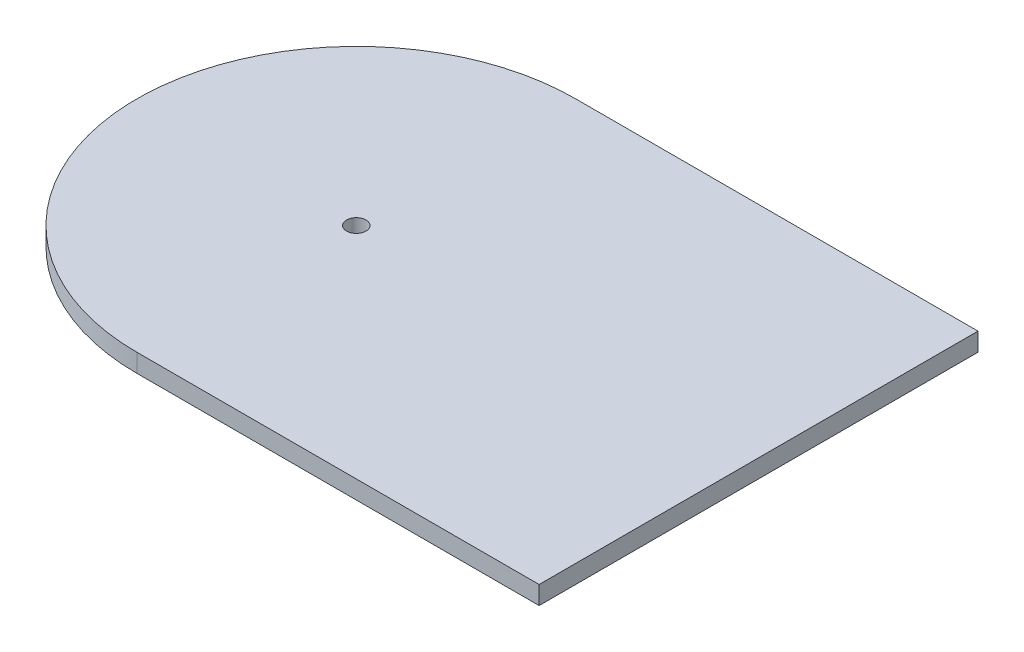
ISO-10303-21;
HEADER;
FILE_DESCRIPTION(('STEP AP214'),'2;1');
FILE_NAME('part.step','',(''),(''),'','','');
FILE_SCHEMA(('AUTOMOTIVE_DESIGN { 1 0 10303 214 1 1 1 1 }'));
ENDSEC;
DATA;
#1=APPLICATION_CONTEXT('core data for automotive mechanical design processes');
#2=APPLICATION_PROTOCOL_DEFINITION('international standard','automotive_design',2000,#1);
#3=PRODUCT_CONTEXT('',#1,'mechanical');
#4=PRODUCT('Part','Part','',(#3));
#5=PRODUCT_RELATED_PRODUCT_CATEGORY('part','',(#4));
#6=PRODUCT_DEFINITION_FORMATION('','',#4);
#7=PRODUCT_DEFINITION_CONTEXT('part definition',#1,'design');
#8=PRODUCT_DEFINITION('design','',#6,#7);
#9=PRODUCT_DEFINITION_SHAPE('','',#8);
#10=(LENGTH_UNIT() NAMED_UNIT(*) SI_UNIT(.MILLI.,.METRE.));
#11=(NAMED_UNIT(*) PLANE_ANGLE_UNIT() SI_UNIT($,.RADIAN.));
#12=(NAMED_UNIT(*) SI_UNIT($,.STERADIAN.) SOLID_ANGLE_UNIT());
#13=UNCERTAINTY_MEASURE_WITH_UNIT(LENGTH_MEASURE(1.E-05),#10,'distance_accuracy_value','');
#14=(GEOMETRIC_REPRESENTATION_CONTEXT(3) GLOBAL_UNCERTAINTY_ASSIGNED_CONTEXT((#13)) GLOBAL_UNIT_ASSIGNED_CONTEXT((#10,
#11,#12)) REPRESENTATION_CONTEXT('',''));
#15=CARTESIAN_POINT('',(0.,0.,0.));
#16=DIRECTION('',(0.,0.,1.));
#17=DIRECTION('',(1.,0.,0.));
#18=AXIS2_PLACEMENT_3D('',#15,#16,#17);
#19=CARTESIAN_POINT('',(0.,6.35,0.));
#20=DIRECTION('',(0.,-1.,0.));
#21=DIRECTION('',(0.,0.,-1.));
#22=AXIS2_PLACEMENT_3D('',#19,#20,#21);
#23=CYLINDRICAL_SURFACE('',#22,76.2);
#24=CARTESIAN_POINT('',(0.,0.,0.));
#25=DIRECTION('',(0.,1.,0.));
#26=DIRECTION('',(0.,0.,1.));
#27=AXIS2_PLACEMENT_3D('',#24,#25,#26);
#28=CIRCLE('',#27,76.2);
#29=CARTESIAN_POINT('',(0.,0.,-76.2));
#30=VERTEX_POINT('',#29);
#31=CARTESIAN_POINT('',(0.,0.,76.2));
#32=VERTEX_POINT('',#31);
#33=EDGE_CURVE('E114',#30,#32,#28,.T.);
#34=ORIENTED_EDGE('',*,*,#33,.T.);
#35=DIRECTION('',(0.,-1.,0.));
#36=VECTOR('',#35,1.);
#37=CARTESIAN_POINT('',(0.,6.35,76.2));
#38=LINE('',#37,#36);
#39=CARTESIAN_POINT('',(0.,6.35,76.2));
#40=VERTEX_POINT('',#39);
#41=EDGE_CURVE('E11',#40,#32,#38,.T.);
#42=ORIENTED_EDGE('',*,*,#41,.F.);
#43=CARTESIAN_POINT('',(0.,6.35,0.));
#44=DIRECTION('',(0.,1.,0.));
#45=DIRECTION('',(0.,0.,1.));
#46=AXIS2_PLACEMENT_3D('',#43,#44,#45);
#47=CIRCLE('',#46,76.2);
#48=CARTESIAN_POINT('',(0.,6.35,-76.2));
#49=VERTEX_POINT('',#48);
#50=EDGE_CURVE('E92',#49,#40,#47,.T.);
#51=ORIENTED_EDGE('',*,*,#50,.F.);
#52=DIRECTION('',(0.,-1.,0.));
#53=VECTOR('',#52,1.);
#54=CARTESIAN_POINT('',(0.,6.35,-76.2));
#55=LINE('',#54,#53);
#56=EDGE_CURVE('E58',#49,#30,#55,.T.);
#57=ORIENTED_EDGE('',*,*,#56,.T.);
#58=EDGE_LOOP('',(#34,#42,#51,#57));
#59=FACE_BOUND('',#58,.T.);
#60=ADVANCED_FACE('F41',(#59),#23,.T.);
#61=CARTESIAN_POINT('',(0.,6.35,76.2));
#62=DIRECTION('',(0.,0.,-1.));
#63=DIRECTION('',(-1.,0.,0.));
#64=AXIS2_PLACEMENT_3D('',#61,#62,#63);
#65=PLANE('',#64);
#66=DIRECTION('',(1.,0.,0.));
#67=VECTOR('',#66,1.);
#68=CARTESIAN_POINT('',(0.,0.,76.2));
#69=LINE('',#68,#67);
#70=CARTESIAN_POINT('',(139.7,0.,76.2));
#71=VERTEX_POINT('',#70);
#72=EDGE_CURVE('E98',#32,#71,#69,.T.);
#73=ORIENTED_EDGE('',*,*,#72,.T.);
#74=DIRECTION('',(0.,-1.,0.));
#75=VECTOR('',#74,1.);
#76=CARTESIAN_POINT('',(139.7,6.35,76.2));
#77=LINE('',#76,#75);
#78=CARTESIAN_POINT('',(139.7,6.35,76.2));
#79=VERTEX_POINT('',#78);
#80=EDGE_CURVE('E50',#79,#71,#77,.T.);
#81=ORIENTED_EDGE('',*,*,#80,.F.);
#82=DIRECTION('',(1.,0.,0.));
#83=VECTOR('',#82,1.);
#84=CARTESIAN_POINT('',(0.,6.35,76.2));
#85=LINE('',#84,#83);
#86=EDGE_CURVE('E84',#40,#79,#85,.T.);
#87=ORIENTED_EDGE('',*,*,#86,.F.);
#88=ORIENTED_EDGE('',*,*,#41,.T.);
#89=EDGE_LOOP('',(#73,#81,#87,#88));
#90=FACE_BOUND('',#89,.T.);
#91=ADVANCED_FACE('F97',(#90),#65,.F.);
#92=CARTESIAN_POINT('',(139.7,6.35,0.));
#93=DIRECTION('',(-1.,0.,0.));
#94=DIRECTION('',(0.,0.,1.));
#95=AXIS2_PLACEMENT_3D('',#92,#93,#94);
#96=PLANE('',#95);
#97=DIRECTION('',(0.,0.,-1.));
#98=VECTOR('',#97,1.);
#99=CARTESIAN_POINT('',(139.7,0.,0.));
#100=LINE('',#99,#98);
#101=CARTESIAN_POINT('',(139.7,0.,-76.2));
#102=VERTEX_POINT('',#101);
#103=EDGE_CURVE('E119',#71,#102,#100,.T.);
#104=ORIENTED_EDGE('',*,*,#103,.T.);
#105=DIRECTION('',(0.,-1.,0.));
#106=VECTOR('',#105,1.);
#107=CARTESIAN_POINT('',(139.7,6.35,-76.2));
#108=LINE('',#107,#106);
#109=CARTESIAN_POINT('',(139.7,6.35,-76.2));
#110=VERTEX_POINT('',#109);
#111=EDGE_CURVE('E73',#110,#102,#108,.T.);
#112=ORIENTED_EDGE('',*,*,#111,.F.);
#113=DIRECTION('',(0.,0.,-1.));
#114=VECTOR('',#113,1.);
#115=CARTESIAN_POINT('',(139.7,6.35,0.));
#116=LINE('',#115,#114);
#117=EDGE_CURVE('E91',#79,#110,#116,.T.);
#118=ORIENTED_EDGE('',*,*,#117,.F.);
#119=ORIENTED_EDGE('',*,*,#80,.T.);
#120=EDGE_LOOP('',(#104,#112,#118,#119));
#121=FACE_BOUND('',#120,.T.);
#122=ADVANCED_FACE('F102',(#121),#96,.F.);
#123=CARTESIAN_POINT('',(0.,6.35,-76.2));
#124=DIRECTION('',(0.,0.,-1.));
#125=DIRECTION('',(-1.,0.,0.));
#126=AXIS2_PLACEMENT_3D('',#123,#124,#125);
#127=PLANE('',#126);
#128=DIRECTION('',(1.,0.,0.));
#129=VECTOR('',#128,1.);
#130=CARTESIAN_POINT('',(0.,0.,-76.2));
#131=LINE('',#130,#129);
#132=EDGE_CURVE('E122',#30,#102,#131,.T.);
#133=ORIENTED_EDGE('',*,*,#132,.F.);
#134=ORIENTED_EDGE('',*,*,#56,.F.);
#135=DIRECTION('',(1.,0.,0.));
#136=VECTOR('',#135,1.);
#137=CARTESIAN_POINT('',(0.,6.35,-76.2));
#138=LINE('',#137,#136);
#139=EDGE_CURVE('E104',#49,#110,#138,.T.);
#140=ORIENTED_EDGE('',*,*,#139,.T.);
#141=ORIENTED_EDGE('',*,*,#111,.T.);
#142=EDGE_LOOP('',(#133,#134,#140,#141));
#143=FACE_BOUND('',#142,.T.);
#144=ADVANCED_FACE('F140',(#143),#127,.T.);
#145=CARTESIAN_POINT('',(0.,6.35,0.));
#146=DIRECTION('',(0.,-1.,0.));
#147=DIRECTION('',(0.,0.,-1.));
#148=AXIS2_PLACEMENT_3D('',#145,#146,#147);
#149=CYLINDRICAL_SURFACE('',#148,3.3655);
#150=CARTESIAN_POINT('',(0.,6.35,0.));
#151=DIRECTION('',(0.,1.,0.));
#152=DIRECTION('',(0.,0.,1.));
#153=AXIS2_PLACEMENT_3D('',#150,#151,#152);
#154=CIRCLE('',#153,3.3655);
#155=CARTESIAN_POINT('',(0.,6.35,3.3655));
#156=VERTEX_POINT('',#155);
#157=EDGE_CURVE('E107',#156,#156,#154,.T.);
#158=ORIENTED_EDGE('',*,*,#157,.T.);
#159=EDGE_LOOP('',(#158));
#160=FACE_BOUND('',#159,.T.);
#161=CARTESIAN_POINT('',(0.,0.,0.));
#162=DIRECTION('',(0.,1.,0.));
#163=DIRECTION('',(0.,0.,1.));
#164=AXIS2_PLACEMENT_3D('',#161,#162,#163);
#165=CIRCLE('',#164,3.3655);
#166=CARTESIAN_POINT('',(0.,0.,3.3655));
#167=VERTEX_POINT('',#166);
#168=EDGE_CURVE('E126',#167,#167,#165,.T.);
#169=ORIENTED_EDGE('',*,*,#168,.F.);
#170=EDGE_LOOP('',(#169));
#171=FACE_BOUND('',#170,.T.);
#172=ADVANCED_FACE('F138',(#160,#171),#149,.F.);
#173=CARTESIAN_POINT('',(0.,6.35,0.));
#174=DIRECTION('',(0.,1.,0.));
#175=DIRECTION('',(0.,0.,1.));
#176=AXIS2_PLACEMENT_3D('',#173,#174,#175);
#177=PLANE('',#176);
#178=ORIENTED_EDGE('',*,*,#50,.T.);
#179=ORIENTED_EDGE('',*,*,#86,.T.);
#180=ORIENTED_EDGE('',*,*,#117,.T.);
#181=ORIENTED_EDGE('',*,*,#139,.F.);
#182=EDGE_LOOP('',(#178,#179,#180,#181));
#183=FACE_BOUND('',#182,.T.);
#184=ORIENTED_EDGE('',*,*,#157,.F.);
#185=EDGE_LOOP('',(#184));
#186=FACE_BOUND('',#185,.T.);
#187=ADVANCED_FACE('F87',(#183,#186),#177,.T.);
#188=CARTESIAN_POINT('',(0.,0.,0.));
#189=DIRECTION('',(0.,1.,0.));
#190=DIRECTION('',(0.,0.,1.));
#191=AXIS2_PLACEMENT_3D('',#188,#189,#190);
#192=PLANE('',#191);
#193=ORIENTED_EDGE('',*,*,#33,.F.);
#194=ORIENTED_EDGE('',*,*,#132,.T.);
#195=ORIENTED_EDGE('',*,*,#103,.F.);
#196=ORIENTED_EDGE('',*,*,#72,.F.);
#197=EDGE_LOOP('',(#193,#194,#195,#196));
#198=FACE_BOUND('',#197,.T.);
#199=ORIENTED_EDGE('',*,*,#168,.T.);
#200=EDGE_LOOP('',(#199));
#201=FACE_BOUND('',#200,.T.);
#202=ADVANCED_FACE('F136',(#198,#201),#192,.F.);
#203=CLOSED_SHELL('',(#60,#91,#122,#144,#172,#187,#202));
#204=MANIFOLD_SOLID_BREP('B2',#203);
#205=ADVANCED_BREP_SHAPE_REPRESENTATION('',(#18,#204),#14);
#206=SHAPE_DEFINITION_REPRESENTATION(#9,#205);
ENDSEC;
END-ISO-10303-21;
